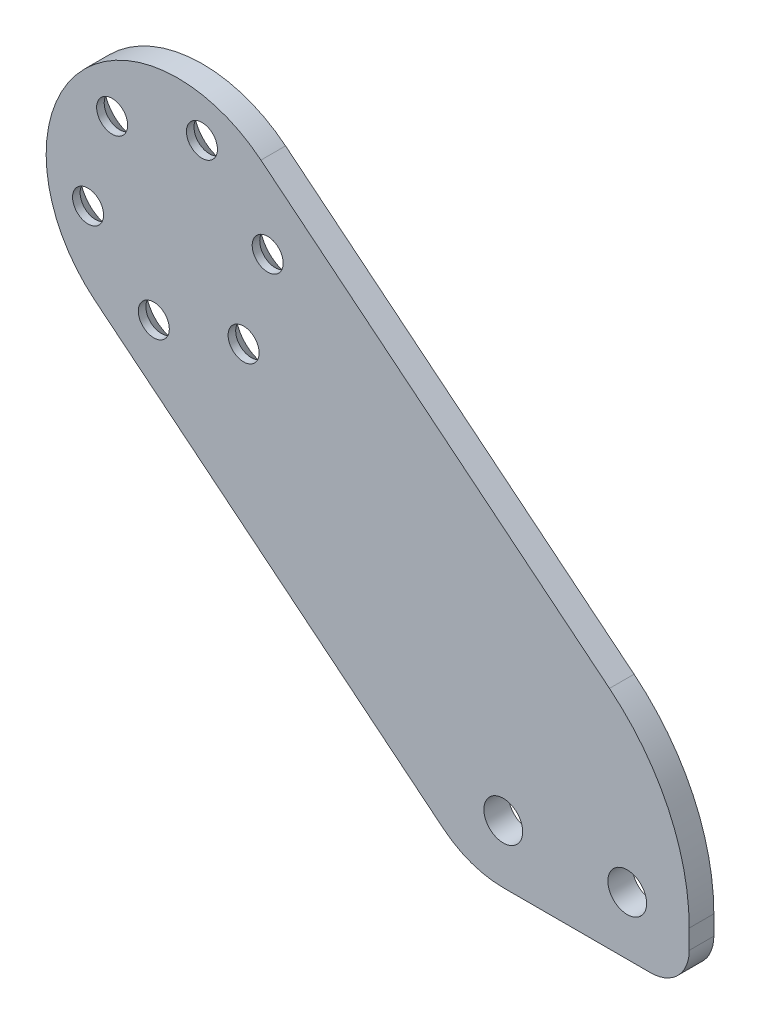
ISO-10303-21;
HEADER;
FILE_DESCRIPTION(('STEP AP214'),'2;1');
FILE_NAME('part.step','',(''),(''),'','','');
FILE_SCHEMA(('AUTOMOTIVE_DESIGN { 1 0 10303 214 1 1 1 1 }'));
ENDSEC;
DATA;
#1=APPLICATION_CONTEXT('core data for automotive mechanical design processes');
#2=APPLICATION_PROTOCOL_DEFINITION('international standard','automotive_design',2000,#1);
#3=PRODUCT_CONTEXT('',#1,'mechanical');
#4=PRODUCT('Part','Part','',(#3));
#5=PRODUCT_RELATED_PRODUCT_CATEGORY('part','',(#4));
#6=PRODUCT_DEFINITION_FORMATION('','',#4);
#7=PRODUCT_DEFINITION_CONTEXT('part definition',#1,'design');
#8=PRODUCT_DEFINITION('design','',#6,#7);
#9=PRODUCT_DEFINITION_SHAPE('','',#8);
#10=(LENGTH_UNIT() NAMED_UNIT(*) SI_UNIT(.MILLI.,.METRE.));
#11=(NAMED_UNIT(*) PLANE_ANGLE_UNIT() SI_UNIT($,.RADIAN.));
#12=(NAMED_UNIT(*) SI_UNIT($,.STERADIAN.) SOLID_ANGLE_UNIT());
#13=UNCERTAINTY_MEASURE_WITH_UNIT(LENGTH_MEASURE(1.E-05),#10,'distance_accuracy_value','');
#14=(GEOMETRIC_REPRESENTATION_CONTEXT(3) GLOBAL_UNCERTAINTY_ASSIGNED_CONTEXT((#13)) GLOBAL_UNIT_ASSIGNED_CONTEXT((#10,
#11,#12)) REPRESENTATION_CONTEXT('',''));
#15=CARTESIAN_POINT('',(0.,0.,0.));
#16=DIRECTION('',(0.,0.,1.));
#17=DIRECTION('',(1.,0.,0.));
#18=AXIS2_PLACEMENT_3D('',#15,#16,#17);
#19=CARTESIAN_POINT('',(38.1233103289566,-45.,3.175));
#20=DIRECTION('',(0.,0.,-1.));
#21=DIRECTION('',(-1.,0.,0.));
#22=AXIS2_PLACEMENT_3D('',#19,#20,#21);
#23=PLANE('',#22);
#24=DIRECTION('',(1.,0.,0.));
#25=VECTOR('',#24,1.);
#26=CARTESIAN_POINT('',(42.,-52.5,3.175));
#27=LINE('',#26,#25);
#28=CARTESIAN_POINT('',(42.,-52.5000000000001,3.175));
#29=VERTEX_POINT('',#28);
#30=CARTESIAN_POINT('',(61.,-52.5,3.175));
#31=VERTEX_POINT('',#30);
#32=EDGE_CURVE('E219',#29,#31,#27,.T.);
#33=ORIENTED_EDGE('',*,*,#32,.T.);
#34=CARTESIAN_POINT('',(61.,-47.5,3.175));
#35=DIRECTION('',(0.,0.,-1.));
#36=DIRECTION('',(-1.,0.,0.));
#37=AXIS2_PLACEMENT_3D('',#34,#35,#36);
#38=CIRCLE('',#37,5.);
#39=CARTESIAN_POINT('',(66.,-47.5,3.175));
#40=VERTEX_POINT('',#39);
#41=EDGE_CURVE('E143',#31,#40,#38,.F.);
#42=ORIENTED_EDGE('',*,*,#41,.T.);
#43=DIRECTION('',(0.,1.,0.));
#44=VECTOR('',#43,1.);
#45=CARTESIAN_POINT('',(66.,-45.,3.175));
#46=LINE('',#45,#44);
#47=CARTESIAN_POINT('',(66.,-45.,3.175));
#48=VERTEX_POINT('',#47);
#49=EDGE_CURVE('E124',#40,#48,#46,.T.);
#50=ORIENTED_EDGE('',*,*,#49,.T.);
#51=CARTESIAN_POINT('',(38.1233103289566,-45.,3.175));
#52=DIRECTION('',(0.,0.,1.));
#53=DIRECTION('',(-1.,0.,0.));
#54=AXIS2_PLACEMENT_3D('',#51,#52,#53);
#55=CIRCLE('',#54,27.8766896710434);
#56=CARTESIAN_POINT('',(55.7051915212923,-23.3669863228849,3.175));
#57=VERTEX_POINT('',#56);
#58=EDGE_CURVE('E119',#48,#57,#55,.T.);
#59=ORIENTED_EDGE('',*,*,#58,.T.);
#60=DIRECTION('',(-0.776025199993032,0.63070190183301,0.));
#61=VECTOR('',#60,1.);
#62=CARTESIAN_POINT('',(55.7051915212923,-23.3669863228849,3.175));
#63=LINE('',#62,#61);
#64=CARTESIAN_POINT('',(10.7219323311611,13.1924283998815,3.175));
#65=VERTEX_POINT('',#64);
#66=EDGE_CURVE('E108',#57,#65,#63,.T.);
#67=ORIENTED_EDGE('',*,*,#66,.T.);
#68=CARTESIAN_POINT('',(0.,0.,3.175));
#69=DIRECTION('',(0.,0.,1.));
#70=DIRECTION('',(1.,0.,0.));
#71=AXIS2_PLACEMENT_3D('',#68,#69,#70);
#72=CIRCLE('',#71,17.);
#73=CARTESIAN_POINT('',(-10.7219323311612,-13.1924283998815,3.175));
#74=VERTEX_POINT('',#73);
#75=EDGE_CURVE('E118',#65,#74,#72,.T.);
#76=ORIENTED_EDGE('',*,*,#75,.T.);
#77=DIRECTION('',(0.776025199993032,-0.63070190183301,0.));
#78=VECTOR('',#77,1.);
#79=CARTESIAN_POINT('',(34.26132685897,-49.751843122648,3.175));
#80=LINE('',#79,#78);
#81=CARTESIAN_POINT('',(34.26132685897,-49.751843122648,3.175));
#82=VERTEX_POINT('',#81);
#83=EDGE_CURVE('E215',#74,#82,#80,.T.);
#84=ORIENTED_EDGE('',*,*,#83,.T.);
#85=CARTESIAN_POINT('',(42.,-40.2300621441937,3.175));
#86=DIRECTION('',(0.,0.,1.));
#87=DIRECTION('',(1.,0.,0.));
#88=AXIS2_PLACEMENT_3D('',#85,#86,#87);
#89=CIRCLE('',#88,12.2699378558064);
#90=EDGE_CURVE('E217',#82,#29,#89,.T.);
#91=ORIENTED_EDGE('',*,*,#90,.T.);
#92=EDGE_LOOP('',(#33,#42,#50,#59,#67,#76,#84,#91));
#93=FACE_BOUND('',#92,.T.);
#94=CARTESIAN_POINT('',(58.,-45.,3.175));
#95=DIRECTION('',(0.,0.,1.));
#96=DIRECTION('',(1.,0.,0.));
#97=AXIS2_PLACEMENT_3D('',#94,#95,#96);
#98=CIRCLE('',#97,2.49999999999994);
#99=CARTESIAN_POINT('',(60.4999999999999,-45.,3.175));
#100=VERTEX_POINT('',#99);
#101=EDGE_CURVE('E210',#100,#100,#98,.T.);
#102=ORIENTED_EDGE('',*,*,#101,.F.);
#103=EDGE_LOOP('',(#102));
#104=FACE_BOUND('',#103,.T.);
#105=CARTESIAN_POINT('',(42.,-45.,3.175));
#106=DIRECTION('',(0.,0.,1.));
#107=DIRECTION('',(1.,0.,0.));
#108=AXIS2_PLACEMENT_3D('',#105,#106,#107);
#109=CIRCLE('',#108,2.49999999999994);
#110=CARTESIAN_POINT('',(44.4999999999999,-45.,3.175));
#111=VERTEX_POINT('',#110);
#112=EDGE_CURVE('E201',#111,#111,#109,.T.);
#113=ORIENTED_EDGE('',*,*,#112,.F.);
#114=EDGE_LOOP('',(#113));
#115=FACE_BOUND('',#114,.T.);
#116=CARTESIAN_POINT('',(-8.48528137423853,8.48528137423861,3.175));
#117=DIRECTION('',(0.,0.,1.));
#118=DIRECTION('',(1.,0.,0.));
#119=AXIS2_PLACEMENT_3D('',#116,#117,#118);
#120=CIRCLE('',#119,2.00000000000003);
#121=CARTESIAN_POINT('',(-6.4852813742385,8.48528137423861,3.175));
#122=VERTEX_POINT('',#121);
#123=EDGE_CURVE('E202',#122,#122,#120,.T.);
#124=ORIENTED_EDGE('',*,*,#123,.F.);
#125=EDGE_LOOP('',(#124));
#126=FACE_BOUND('',#125,.T.);
#127=CARTESIAN_POINT('',(3.1058285412303,11.5911099154688,3.175));
#128=DIRECTION('',(0.,0.,1.));
#129=DIRECTION('',(1.,0.,0.));
#130=AXIS2_PLACEMENT_3D('',#127,#128,#129);
#131=CIRCLE('',#130,2.00000000000004);
#132=CARTESIAN_POINT('',(5.10582854123033,11.5911099154688,3.175));
#133=VERTEX_POINT('',#132);
#134=EDGE_CURVE('E207',#133,#133,#131,.T.);
#135=ORIENTED_EDGE('',*,*,#134,.F.);
#136=EDGE_LOOP('',(#135));
#137=FACE_BOUND('',#136,.T.);
#138=CARTESIAN_POINT('',(11.5911099154688,3.10582854123019,3.175));
#139=DIRECTION('',(0.,0.,1.));
#140=DIRECTION('',(1.,0.,0.));
#141=AXIS2_PLACEMENT_3D('',#138,#139,#140);
#142=CIRCLE('',#141,2.00000000000001);
#143=CARTESIAN_POINT('',(13.5911099154688,3.10582854123019,3.175));
#144=VERTEX_POINT('',#143);
#145=EDGE_CURVE('E494',#144,#144,#142,.T.);
#146=ORIENTED_EDGE('',*,*,#145,.F.);
#147=EDGE_LOOP('',(#146));
#148=FACE_BOUND('',#147,.T.);
#149=CARTESIAN_POINT('',(8.48528137423854,-8.48528137423861,3.175));
#150=DIRECTION('',(0.,0.,1.));
#151=DIRECTION('',(1.,0.,0.));
#152=AXIS2_PLACEMENT_3D('',#149,#150,#151);
#153=CIRCLE('',#152,1.99999999999999);
#154=CARTESIAN_POINT('',(10.4852813742385,-8.48528137423861,3.175));
#155=VERTEX_POINT('',#154);
#156=EDGE_CURVE('E496',#155,#155,#153,.T.);
#157=ORIENTED_EDGE('',*,*,#156,.F.);
#158=EDGE_LOOP('',(#157));
#159=FACE_BOUND('',#158,.T.);
#160=CARTESIAN_POINT('',(-3.10582854123031,-11.5911099154688,3.175));
#161=DIRECTION('',(0.,0.,1.));
#162=DIRECTION('',(1.,0.,0.));
#163=AXIS2_PLACEMENT_3D('',#160,#161,#162);
#164=CIRCLE('',#163,2.);
#165=CARTESIAN_POINT('',(-1.10582854123031,-11.5911099154688,3.175));
#166=VERTEX_POINT('',#165);
#167=EDGE_CURVE('E501',#166,#166,#164,.T.);
#168=ORIENTED_EDGE('',*,*,#167,.F.);
#169=EDGE_LOOP('',(#168));
#170=FACE_BOUND('',#169,.T.);
#171=CARTESIAN_POINT('',(-11.5911099154688,-3.10582854123021,3.175));
#172=DIRECTION('',(0.,0.,1.));
#173=DIRECTION('',(1.,0.,0.));
#174=AXIS2_PLACEMENT_3D('',#171,#172,#173);
#175=CIRCLE('',#174,2.00000000000001);
#176=CARTESIAN_POINT('',(-9.59110991546882,-3.10582854123021,3.175));
#177=VERTEX_POINT('',#176);
#178=EDGE_CURVE('E506',#177,#177,#175,.T.);
#179=ORIENTED_EDGE('',*,*,#178,.F.);
#180=EDGE_LOOP('',(#179));
#181=FACE_BOUND('',#180,.T.);
#182=ADVANCED_FACE('F40',(#93,#104,#115,#126,#137,#148,#159,#170,#181),#23,.F.);
#183=CARTESIAN_POINT('',(38.1233103289566,-45.,0.));
#184=DIRECTION('',(0.,0.,-1.));
#185=DIRECTION('',(-1.,0.,0.));
#186=AXIS2_PLACEMENT_3D('',#183,#184,#185);
#187=PLANE('',#186);
#188=CARTESIAN_POINT('',(8.48528137423854,-8.48528137423861,0.));
#189=DIRECTION('',(0.,0.,-1.));
#190=DIRECTION('',(-1.,0.,0.));
#191=AXIS2_PLACEMENT_3D('',#188,#189,#190);
#192=CIRCLE('',#191,4.19999999999998);
#193=CARTESIAN_POINT('',(4.28528137423855,-8.48528137423861,0.));
#194=VERTEX_POINT('',#193);
#195=EDGE_CURVE('E160',#194,#194,#192,.F.);
#196=ORIENTED_EDGE('',*,*,#195,.T.);
#197=EDGE_LOOP('',(#196));
#198=FACE_BOUND('',#197,.T.);
#199=CARTESIAN_POINT('',(-3.10582854123031,-11.5911099154688,0.));
#200=DIRECTION('',(0.,0.,-1.));
#201=DIRECTION('',(-1.,0.,0.));
#202=AXIS2_PLACEMENT_3D('',#199,#200,#201);
#203=CIRCLE('',#202,4.19999999999998);
#204=CARTESIAN_POINT('',(-7.30582854123029,-11.5911099154688,0.));
#205=VERTEX_POINT('',#204);
#206=EDGE_CURVE('E157',#205,#205,#203,.F.);
#207=ORIENTED_EDGE('',*,*,#206,.T.);
#208=EDGE_LOOP('',(#207));
#209=FACE_BOUND('',#208,.T.);
#210=CARTESIAN_POINT('',(-11.5911099154688,-3.10582854123021,0.));
#211=DIRECTION('',(0.,0.,-1.));
#212=DIRECTION('',(-1.,0.,0.));
#213=AXIS2_PLACEMENT_3D('',#210,#211,#212);
#214=CIRCLE('',#213,4.20000000000001);
#215=CARTESIAN_POINT('',(-15.7911099154688,-3.10582854123021,0.));
#216=VERTEX_POINT('',#215);
#217=EDGE_CURVE('E154',#216,#216,#214,.F.);
#218=ORIENTED_EDGE('',*,*,#217,.T.);
#219=EDGE_LOOP('',(#218));
#220=FACE_BOUND('',#219,.T.);
#221=CARTESIAN_POINT('',(-8.48528137423853,8.48528137423861,0.));
#222=DIRECTION('',(0.,0.,-1.));
#223=DIRECTION('',(-1.,0.,0.));
#224=AXIS2_PLACEMENT_3D('',#221,#222,#223);
#225=CIRCLE('',#224,4.20000000000002);
#226=CARTESIAN_POINT('',(-12.6852813742386,8.48528137423861,0.));
#227=VERTEX_POINT('',#226);
#228=EDGE_CURVE('E151',#227,#227,#225,.F.);
#229=ORIENTED_EDGE('',*,*,#228,.T.);
#230=EDGE_LOOP('',(#229));
#231=FACE_BOUND('',#230,.T.);
#232=CARTESIAN_POINT('',(3.1058285412303,11.5911099154688,0.));
#233=DIRECTION('',(0.,0.,-1.));
#234=DIRECTION('',(-1.,0.,0.));
#235=AXIS2_PLACEMENT_3D('',#232,#233,#234);
#236=CIRCLE('',#235,4.20000000000007);
#237=CARTESIAN_POINT('',(-1.09417145876977,11.5911099154688,0.));
#238=VERTEX_POINT('',#237);
#239=EDGE_CURVE('E148',#238,#238,#236,.F.);
#240=ORIENTED_EDGE('',*,*,#239,.T.);
#241=EDGE_LOOP('',(#240));
#242=FACE_BOUND('',#241,.T.);
#243=CARTESIAN_POINT('',(11.5911099154688,3.10582854123019,0.));
#244=DIRECTION('',(0.,0.,-1.));
#245=DIRECTION('',(-1.,0.,0.));
#246=AXIS2_PLACEMENT_3D('',#243,#244,#245);
#247=CIRCLE('',#246,4.20000000000002);
#248=CARTESIAN_POINT('',(7.39110991546881,3.10582854123019,0.));
#249=VERTEX_POINT('',#248);
#250=EDGE_CURVE('E145',#249,#249,#247,.F.);
#251=ORIENTED_EDGE('',*,*,#250,.T.);
#252=EDGE_LOOP('',(#251));
#253=FACE_BOUND('',#252,.T.);
#254=CARTESIAN_POINT('',(58.,-45.,0.));
#255=DIRECTION('',(0.,0.,1.));
#256=DIRECTION('',(1.,0.,0.));
#257=AXIS2_PLACEMENT_3D('',#254,#255,#256);
#258=CIRCLE('',#257,2.49999999999994);
#259=CARTESIAN_POINT('',(60.4999999999999,-45.,0.));
#260=VERTEX_POINT('',#259);
#261=EDGE_CURVE('E195',#260,#260,#258,.T.);
#262=ORIENTED_EDGE('',*,*,#261,.T.);
#263=EDGE_LOOP('',(#262));
#264=FACE_BOUND('',#263,.T.);
#265=DIRECTION('',(0.,1.,0.));
#266=VECTOR('',#265,1.);
#267=CARTESIAN_POINT('',(66.,-45.,0.));
#268=LINE('',#267,#266);
#269=CARTESIAN_POINT('',(66.,-47.5,0.));
#270=VERTEX_POINT('',#269);
#271=CARTESIAN_POINT('',(66.,-45.,0.));
#272=VERTEX_POINT('',#271);
#273=EDGE_CURVE('E128',#270,#272,#268,.T.);
#274=ORIENTED_EDGE('',*,*,#273,.F.);
#275=CARTESIAN_POINT('',(61.,-47.5,0.));
#276=DIRECTION('',(0.,0.,-1.));
#277=DIRECTION('',(-1.,0.,0.));
#278=AXIS2_PLACEMENT_3D('',#275,#276,#277);
#279=CIRCLE('',#278,5.);
#280=CARTESIAN_POINT('',(61.,-52.5,0.));
#281=VERTEX_POINT('',#280);
#282=EDGE_CURVE('E64',#270,#281,#279,.T.);
#283=ORIENTED_EDGE('',*,*,#282,.T.);
#284=DIRECTION('',(1.,0.,0.));
#285=VECTOR('',#284,1.);
#286=CARTESIAN_POINT('',(42.,-52.5,0.));
#287=LINE('',#286,#285);
#288=CARTESIAN_POINT('',(42.,-52.5000000000001,0.));
#289=VERTEX_POINT('',#288);
#290=EDGE_CURVE('E232',#289,#281,#287,.T.);
#291=ORIENTED_EDGE('',*,*,#290,.F.);
#292=CARTESIAN_POINT('',(42.,-40.2300621441937,0.));
#293=DIRECTION('',(0.,0.,1.));
#294=DIRECTION('',(1.,0.,0.));
#295=AXIS2_PLACEMENT_3D('',#292,#293,#294);
#296=CIRCLE('',#295,12.2699378558064);
#297=CARTESIAN_POINT('',(34.26132685897,-49.751843122648,0.));
#298=VERTEX_POINT('',#297);
#299=EDGE_CURVE('E230',#298,#289,#296,.T.);
#300=ORIENTED_EDGE('',*,*,#299,.F.);
#301=DIRECTION('',(0.776025199993032,-0.63070190183301,0.));
#302=VECTOR('',#301,1.);
#303=CARTESIAN_POINT('',(34.26132685897,-49.751843122648,0.));
#304=LINE('',#303,#302);
#305=CARTESIAN_POINT('',(-10.7219323311612,-13.1924283998815,0.));
#306=VERTEX_POINT('',#305);
#307=EDGE_CURVE('E228',#306,#298,#304,.T.);
#308=ORIENTED_EDGE('',*,*,#307,.F.);
#309=CARTESIAN_POINT('',(0.,0.,0.));
#310=DIRECTION('',(0.,0.,1.));
#311=DIRECTION('',(1.,0.,0.));
#312=AXIS2_PLACEMENT_3D('',#309,#310,#311);
#313=CIRCLE('',#312,17.);
#314=CARTESIAN_POINT('',(10.7219323311611,13.1924283998815,0.));
#315=VERTEX_POINT('',#314);
#316=EDGE_CURVE('E226',#315,#306,#313,.T.);
#317=ORIENTED_EDGE('',*,*,#316,.F.);
#318=DIRECTION('',(-0.776025199993032,0.63070190183301,0.));
#319=VECTOR('',#318,1.);
#320=CARTESIAN_POINT('',(55.7051915212923,-23.3669863228849,0.));
#321=LINE('',#320,#319);
#322=CARTESIAN_POINT('',(55.7051915212923,-23.3669863228849,0.));
#323=VERTEX_POINT('',#322);
#324=EDGE_CURVE('E224',#323,#315,#321,.T.);
#325=ORIENTED_EDGE('',*,*,#324,.F.);
#326=CARTESIAN_POINT('',(38.1233103289566,-45.,0.));
#327=DIRECTION('',(0.,0.,1.));
#328=DIRECTION('',(-1.,0.,0.));
#329=AXIS2_PLACEMENT_3D('',#326,#327,#328);
#330=CIRCLE('',#329,27.8766896710434);
#331=EDGE_CURVE('E132',#272,#323,#330,.T.);
#332=ORIENTED_EDGE('',*,*,#331,.F.);
#333=EDGE_LOOP('',(#274,#283,#291,#300,#308,#317,#325,#332));
#334=FACE_BOUND('',#333,.T.);
#335=CARTESIAN_POINT('',(42.,-45.,0.));
#336=DIRECTION('',(0.,0.,1.));
#337=DIRECTION('',(1.,0.,0.));
#338=AXIS2_PLACEMENT_3D('',#335,#336,#337);
#339=CIRCLE('',#338,2.49999999999994);
#340=CARTESIAN_POINT('',(44.4999999999999,-45.,0.));
#341=VERTEX_POINT('',#340);
#342=EDGE_CURVE('E199',#341,#341,#339,.T.);
#343=ORIENTED_EDGE('',*,*,#342,.T.);
#344=EDGE_LOOP('',(#343));
#345=FACE_BOUND('',#344,.T.);
#346=ADVANCED_FACE('F186',(#198,#209,#220,#231,#242,#253,#264,#334,#345),#187,.T.);
#347=CARTESIAN_POINT('',(38.1233103289566,-45.,3.175));
#348=DIRECTION('',(0.,0.,-1.));
#349=DIRECTION('',(-1.,0.,0.));
#350=AXIS2_PLACEMENT_3D('',#347,#348,#349);
#351=CYLINDRICAL_SURFACE('',#350,27.8766896710434);
#352=ORIENTED_EDGE('',*,*,#331,.T.);
#353=DIRECTION('',(0.,0.,-1.));
#354=VECTOR('',#353,1.);
#355=CARTESIAN_POINT('',(55.7051915212923,-23.3669863228849,3.175));
#356=LINE('',#355,#354);
#357=EDGE_CURVE('E112',#57,#323,#356,.T.);
#358=ORIENTED_EDGE('',*,*,#357,.F.);
#359=ORIENTED_EDGE('',*,*,#58,.F.);
#360=DIRECTION('',(0.,0.,-1.));
#361=VECTOR('',#360,1.);
#362=CARTESIAN_POINT('',(66.,-45.,3.175));
#363=LINE('',#362,#361);
#364=EDGE_CURVE('E222',#48,#272,#363,.T.);
#365=ORIENTED_EDGE('',*,*,#364,.T.);
#366=EDGE_LOOP('',(#352,#358,#359,#365));
#367=FACE_BOUND('',#366,.T.);
#368=ADVANCED_FACE('F130',(#367),#351,.T.);
#369=CARTESIAN_POINT('',(55.7051915212923,-23.3669863228849,3.175));
#370=DIRECTION('',(-0.630701901833009,-0.776025199993032,0.));
#371=DIRECTION('',(0.776025199993032,-0.63070190183301,0.));
#372=AXIS2_PLACEMENT_3D('',#369,#370,#371);
#373=PLANE('',#372);
#374=ORIENTED_EDGE('',*,*,#324,.T.);
#375=DIRECTION('',(0.,0.,-1.));
#376=VECTOR('',#375,1.);
#377=CARTESIAN_POINT('',(10.7219323311611,13.1924283998815,3.175));
#378=LINE('',#377,#376);
#379=EDGE_CURVE('E115',#65,#315,#378,.T.);
#380=ORIENTED_EDGE('',*,*,#379,.F.);
#381=ORIENTED_EDGE('',*,*,#66,.F.);
#382=ORIENTED_EDGE('',*,*,#357,.T.);
#383=EDGE_LOOP('',(#374,#380,#381,#382));
#384=FACE_BOUND('',#383,.T.);
#385=ADVANCED_FACE('F110',(#384),#373,.F.);
#386=CARTESIAN_POINT('',(0.,0.,3.175));
#387=DIRECTION('',(0.,0.,-1.));
#388=DIRECTION('',(-1.,0.,0.));
#389=AXIS2_PLACEMENT_3D('',#386,#387,#388);
#390=CYLINDRICAL_SURFACE('',#389,17.);
#391=ORIENTED_EDGE('',*,*,#316,.T.);
#392=DIRECTION('',(0.,0.,-1.));
#393=VECTOR('',#392,1.);
#394=CARTESIAN_POINT('',(-10.7219323311612,-13.1924283998815,3.175));
#395=LINE('',#394,#393);
#396=EDGE_CURVE('E137',#74,#306,#395,.T.);
#397=ORIENTED_EDGE('',*,*,#396,.F.);
#398=ORIENTED_EDGE('',*,*,#75,.F.);
#399=ORIENTED_EDGE('',*,*,#379,.T.);
#400=EDGE_LOOP('',(#391,#397,#398,#399));
#401=FACE_BOUND('',#400,.T.);
#402=ADVANCED_FACE('F262',(#401),#390,.T.);
#403=CARTESIAN_POINT('',(34.26132685897,-49.751843122648,3.175));
#404=DIRECTION('',(0.63070190183301,0.776025199993032,0.));
#405=DIRECTION('',(-0.776025199993032,0.63070190183301,0.));
#406=AXIS2_PLACEMENT_3D('',#403,#404,#405);
#407=PLANE('',#406);
#408=ORIENTED_EDGE('',*,*,#307,.T.);
#409=DIRECTION('',(0.,0.,-1.));
#410=VECTOR('',#409,1.);
#411=CARTESIAN_POINT('',(34.26132685897,-49.751843122648,3.175));
#412=LINE('',#411,#410);
#413=EDGE_CURVE('E239',#82,#298,#412,.T.);
#414=ORIENTED_EDGE('',*,*,#413,.F.);
#415=ORIENTED_EDGE('',*,*,#83,.F.);
#416=ORIENTED_EDGE('',*,*,#396,.T.);
#417=EDGE_LOOP('',(#408,#414,#415,#416));
#418=FACE_BOUND('',#417,.T.);
#419=ADVANCED_FACE('F246',(#418),#407,.F.);
#420=CARTESIAN_POINT('',(42.,-40.2300621441937,3.175));
#421=DIRECTION('',(0.,0.,-1.));
#422=DIRECTION('',(-1.,0.,0.));
#423=AXIS2_PLACEMENT_3D('',#420,#421,#422);
#424=CYLINDRICAL_SURFACE('',#423,12.2699378558064);
#425=ORIENTED_EDGE('',*,*,#299,.T.);
#426=DIRECTION('',(0.,0.,-1.));
#427=VECTOR('',#426,1.);
#428=CARTESIAN_POINT('',(42.,-52.5000000000001,3.175));
#429=LINE('',#428,#427);
#430=EDGE_CURVE('E236',#29,#289,#429,.T.);
#431=ORIENTED_EDGE('',*,*,#430,.F.);
#432=ORIENTED_EDGE('',*,*,#90,.F.);
#433=ORIENTED_EDGE('',*,*,#413,.T.);
#434=EDGE_LOOP('',(#425,#431,#432,#433));
#435=FACE_BOUND('',#434,.T.);
#436=ADVANCED_FACE('F253',(#435),#424,.T.);
#437=CARTESIAN_POINT('',(42.,-52.5,3.175));
#438=DIRECTION('',(0.,1.,0.));
#439=DIRECTION('',(0.,0.,1.));
#440=AXIS2_PLACEMENT_3D('',#437,#438,#439);
#441=PLANE('',#440);
#442=ORIENTED_EDGE('',*,*,#290,.T.);
#443=DIRECTION('',(0.,0.,-1.));
#444=VECTOR('',#443,1.);
#445=CARTESIAN_POINT('',(61.,-52.5,3.175));
#446=LINE('',#445,#444);
#447=EDGE_CURVE('E56',#281,#31,#446,.F.);
#448=ORIENTED_EDGE('',*,*,#447,.T.);
#449=ORIENTED_EDGE('',*,*,#32,.F.);
#450=ORIENTED_EDGE('',*,*,#430,.T.);
#451=EDGE_LOOP('',(#442,#448,#449,#450));
#452=FACE_BOUND('',#451,.T.);
#453=ADVANCED_FACE('F255',(#452),#441,.F.);
#454=CARTESIAN_POINT('',(66.,-45.,3.175));
#455=DIRECTION('',(-1.,0.,0.));
#456=DIRECTION('',(0.,-1.,0.));
#457=AXIS2_PLACEMENT_3D('',#454,#455,#456);
#458=PLANE('',#457);
#459=ORIENTED_EDGE('',*,*,#49,.F.);
#460=DIRECTION('',(0.,0.,-1.));
#461=VECTOR('',#460,1.);
#462=CARTESIAN_POINT('',(66.,-47.5,3.175));
#463=LINE('',#462,#461);
#464=EDGE_CURVE('E133',#40,#270,#463,.T.);
#465=ORIENTED_EDGE('',*,*,#464,.T.);
#466=ORIENTED_EDGE('',*,*,#273,.T.);
#467=ORIENTED_EDGE('',*,*,#364,.F.);
#468=EDGE_LOOP('',(#459,#465,#466,#467));
#469=FACE_BOUND('',#468,.T.);
#470=ADVANCED_FACE('F261',(#469),#458,.F.);
#471=CARTESIAN_POINT('',(58.,-45.,3.175));
#472=DIRECTION('',(0.,0.,-1.));
#473=DIRECTION('',(-1.,0.,0.));
#474=AXIS2_PLACEMENT_3D('',#471,#472,#473);
#475=CYLINDRICAL_SURFACE('',#474,2.49999999999994);
#476=ORIENTED_EDGE('',*,*,#101,.T.);
#477=EDGE_LOOP('',(#476));
#478=FACE_BOUND('',#477,.T.);
#479=ORIENTED_EDGE('',*,*,#261,.F.);
#480=EDGE_LOOP('',(#479));
#481=FACE_BOUND('',#480,.T.);
#482=ADVANCED_FACE('F276',(#478,#481),#475,.F.);
#483=CARTESIAN_POINT('',(42.,-45.,3.175));
#484=DIRECTION('',(0.,0.,-1.));
#485=DIRECTION('',(-1.,0.,0.));
#486=AXIS2_PLACEMENT_3D('',#483,#484,#485);
#487=CYLINDRICAL_SURFACE('',#486,2.49999999999994);
#488=ORIENTED_EDGE('',*,*,#112,.T.);
#489=EDGE_LOOP('',(#488));
#490=FACE_BOUND('',#489,.T.);
#491=ORIENTED_EDGE('',*,*,#342,.F.);
#492=EDGE_LOOP('',(#491));
#493=FACE_BOUND('',#492,.T.);
#494=ADVANCED_FACE('F303',(#490,#493),#487,.F.);
#495=CARTESIAN_POINT('',(-8.48528137423853,8.48528137423861,3.175));
#496=DIRECTION('',(0.,0.,-1.));
#497=DIRECTION('',(-1.,0.,0.));
#498=AXIS2_PLACEMENT_3D('',#495,#496,#497);
#499=CYLINDRICAL_SURFACE('',#498,2.00000000000003);
#500=CARTESIAN_POINT('',(-8.48528137423853,8.48528137423861,2.2));
#501=DIRECTION('',(0.,0.,-1.));
#502=DIRECTION('',(-1.,0.,0.));
#503=AXIS2_PLACEMENT_3D('',#500,#501,#502);
#504=CIRCLE('',#503,2.00000000000003);
#505=CARTESIAN_POINT('',(-10.4852813742386,8.48528137423861,2.2));
#506=VERTEX_POINT('',#505);
#507=EDGE_CURVE('E172',#506,#506,#504,.T.);
#508=ORIENTED_EDGE('',*,*,#507,.T.);
#509=EDGE_LOOP('',(#508));
#510=FACE_BOUND('',#509,.T.);
#511=ORIENTED_EDGE('',*,*,#123,.T.);
#512=EDGE_LOOP('',(#511));
#513=FACE_BOUND('',#512,.T.);
#514=ADVANCED_FACE('F310',(#510,#513),#499,.F.);
#515=CARTESIAN_POINT('',(3.1058285412303,11.5911099154688,3.175));
#516=DIRECTION('',(0.,0.,-1.));
#517=DIRECTION('',(-1.,0.,0.));
#518=AXIS2_PLACEMENT_3D('',#515,#516,#517);
#519=CYLINDRICAL_SURFACE('',#518,2.00000000000004);
#520=CARTESIAN_POINT('',(3.1058285412303,11.5911099154688,2.20000000000002));
#521=DIRECTION('',(0.,0.,-1.));
#522=DIRECTION('',(-1.,0.,0.));
#523=AXIS2_PLACEMENT_3D('',#520,#521,#522);
#524=CIRCLE('',#523,2.00000000000004);
#525=CARTESIAN_POINT('',(1.10582854123026,11.5911099154688,2.20000000000002));
#526=VERTEX_POINT('',#525);
#527=EDGE_CURVE('E49',#526,#526,#524,.T.);
#528=ORIENTED_EDGE('',*,*,#527,.T.);
#529=EDGE_LOOP('',(#528));
#530=FACE_BOUND('',#529,.T.);
#531=ORIENTED_EDGE('',*,*,#134,.T.);
#532=EDGE_LOOP('',(#531));
#533=FACE_BOUND('',#532,.T.);
#534=ADVANCED_FACE('F177',(#530,#533),#519,.F.);
#535=CARTESIAN_POINT('',(11.5911099154688,3.10582854123019,3.175));
#536=DIRECTION('',(0.,0.,-1.));
#537=DIRECTION('',(-1.,0.,0.));
#538=AXIS2_PLACEMENT_3D('',#535,#536,#537);
#539=CYLINDRICAL_SURFACE('',#538,2.00000000000001);
#540=CARTESIAN_POINT('',(11.5911099154688,3.10582854123019,2.20000000000002));
#541=DIRECTION('',(0.,0.,-1.));
#542=DIRECTION('',(-1.,0.,0.));
#543=AXIS2_PLACEMENT_3D('',#540,#541,#542);
#544=CIRCLE('',#543,2.00000000000001);
#545=CARTESIAN_POINT('',(9.59110991546882,3.10582854123019,2.20000000000002));
#546=VERTEX_POINT('',#545);
#547=EDGE_CURVE('E11',#546,#546,#544,.T.);
#548=ORIENTED_EDGE('',*,*,#547,.T.);
#549=EDGE_LOOP('',(#548));
#550=FACE_BOUND('',#549,.T.);
#551=ORIENTED_EDGE('',*,*,#145,.T.);
#552=EDGE_LOOP('',(#551));
#553=FACE_BOUND('',#552,.T.);
#554=ADVANCED_FACE('F325',(#550,#553),#539,.F.);
#555=CARTESIAN_POINT('',(8.48528137423854,-8.48528137423861,3.175));
#556=DIRECTION('',(0.,0.,-1.));
#557=DIRECTION('',(-1.,0.,0.));
#558=AXIS2_PLACEMENT_3D('',#555,#556,#557);
#559=CYLINDRICAL_SURFACE('',#558,1.99999999999999);
#560=CARTESIAN_POINT('',(8.48528137423854,-8.48528137423861,2.2));
#561=DIRECTION('',(0.,0.,-1.));
#562=DIRECTION('',(-1.,0.,0.));
#563=AXIS2_PLACEMENT_3D('',#560,#561,#562);
#564=CIRCLE('',#563,1.99999999999999);
#565=CARTESIAN_POINT('',(6.48528137423855,-8.48528137423861,2.2));
#566=VERTEX_POINT('',#565);
#567=EDGE_CURVE('E163',#566,#566,#564,.T.);
#568=ORIENTED_EDGE('',*,*,#567,.T.);
#569=EDGE_LOOP('',(#568));
#570=FACE_BOUND('',#569,.T.);
#571=ORIENTED_EDGE('',*,*,#156,.T.);
#572=EDGE_LOOP('',(#571));
#573=FACE_BOUND('',#572,.T.);
#574=ADVANCED_FACE('F332',(#570,#573),#559,.F.);
#575=CARTESIAN_POINT('',(-3.10582854123031,-11.5911099154688,3.175));
#576=DIRECTION('',(0.,0.,-1.));
#577=DIRECTION('',(-1.,0.,0.));
#578=AXIS2_PLACEMENT_3D('',#575,#576,#577);
#579=CYLINDRICAL_SURFACE('',#578,2.);
#580=CARTESIAN_POINT('',(-3.10582854123031,-11.5911099154688,2.19999999999999));
#581=DIRECTION('',(0.,0.,-1.));
#582=DIRECTION('',(-1.,0.,0.));
#583=AXIS2_PLACEMENT_3D('',#580,#581,#582);
#584=CIRCLE('',#583,2.);
#585=CARTESIAN_POINT('',(-5.1058285412303,-11.5911099154688,2.19999999999999));
#586=VERTEX_POINT('',#585);
#587=EDGE_CURVE('E166',#586,#586,#584,.T.);
#588=ORIENTED_EDGE('',*,*,#587,.T.);
#589=EDGE_LOOP('',(#588));
#590=FACE_BOUND('',#589,.T.);
#591=ORIENTED_EDGE('',*,*,#167,.T.);
#592=EDGE_LOOP('',(#591));
#593=FACE_BOUND('',#592,.T.);
#594=ADVANCED_FACE('F340',(#590,#593),#579,.F.);
#595=CARTESIAN_POINT('',(-11.5911099154688,-3.10582854123021,3.175));
#596=DIRECTION('',(0.,0.,-1.));
#597=DIRECTION('',(-1.,0.,0.));
#598=AXIS2_PLACEMENT_3D('',#595,#596,#597);
#599=CYLINDRICAL_SURFACE('',#598,2.00000000000001);
#600=CARTESIAN_POINT('',(-11.5911099154688,-3.10582854123021,2.20000000000001));
#601=DIRECTION('',(0.,0.,-1.));
#602=DIRECTION('',(-1.,0.,0.));
#603=AXIS2_PLACEMENT_3D('',#600,#601,#602);
#604=CIRCLE('',#603,2.00000000000001);
#605=CARTESIAN_POINT('',(-13.5911099154688,-3.10582854123021,2.20000000000001));
#606=VERTEX_POINT('',#605);
#607=EDGE_CURVE('E169',#606,#606,#604,.T.);
#608=ORIENTED_EDGE('',*,*,#607,.T.);
#609=EDGE_LOOP('',(#608));
#610=FACE_BOUND('',#609,.T.);
#611=ORIENTED_EDGE('',*,*,#178,.T.);
#612=EDGE_LOOP('',(#611));
#613=FACE_BOUND('',#612,.T.);
#614=ADVANCED_FACE('F348',(#610,#613),#599,.F.);
#615=CARTESIAN_POINT('',(61.,-47.5,3.175));
#616=DIRECTION('',(0.,0.,-1.));
#617=DIRECTION('',(-1.,0.,0.));
#618=AXIS2_PLACEMENT_3D('',#615,#616,#617);
#619=CYLINDRICAL_SURFACE('',#618,5.);
#620=ORIENTED_EDGE('',*,*,#41,.F.);
#621=ORIENTED_EDGE('',*,*,#447,.F.);
#622=ORIENTED_EDGE('',*,*,#282,.F.);
#623=ORIENTED_EDGE('',*,*,#464,.F.);
#624=EDGE_LOOP('',(#620,#621,#622,#623));
#625=FACE_BOUND('',#624,.T.);
#626=ADVANCED_FACE('F259',(#625),#619,.T.);
#627=CARTESIAN_POINT('',(8.48528137423854,-8.48528137423861,0.));
#628=DIRECTION('',(0.,0.,-1.));
#629=DIRECTION('',(-1.,0.,0.));
#630=AXIS2_PLACEMENT_3D('',#627,#628,#629);
#631=CONICAL_SURFACE('',#630,4.19999999999998,0.785398163397447);
#632=ORIENTED_EDGE('',*,*,#567,.F.);
#633=EDGE_LOOP('',(#632));
#634=FACE_BOUND('',#633,.T.);
#635=ORIENTED_EDGE('',*,*,#195,.F.);
#636=EDGE_LOOP('',(#635));
#637=FACE_BOUND('',#636,.T.);
#638=ADVANCED_FACE('F363',(#634,#637),#631,.F.);
#639=CARTESIAN_POINT('',(-3.10582854123031,-11.5911099154688,0.));
#640=DIRECTION('',(0.,0.,-1.));
#641=DIRECTION('',(-1.,0.,0.));
#642=AXIS2_PLACEMENT_3D('',#639,#640,#641);
#643=CONICAL_SURFACE('',#642,4.19999999999998,0.785398163397447);
#644=ORIENTED_EDGE('',*,*,#587,.F.);
#645=EDGE_LOOP('',(#644));
#646=FACE_BOUND('',#645,.T.);
#647=ORIENTED_EDGE('',*,*,#206,.F.);
#648=EDGE_LOOP('',(#647));
#649=FACE_BOUND('',#648,.T.);
#650=ADVANCED_FACE('F369',(#646,#649),#643,.F.);
#651=CARTESIAN_POINT('',(-11.5911099154688,-3.10582854123021,0.));
#652=DIRECTION('',(0.,0.,-1.));
#653=DIRECTION('',(-1.,0.,0.));
#654=AXIS2_PLACEMENT_3D('',#651,#652,#653);
#655=CONICAL_SURFACE('',#654,4.20000000000001,0.785398163397446);
#656=ORIENTED_EDGE('',*,*,#607,.F.);
#657=EDGE_LOOP('',(#656));
#658=FACE_BOUND('',#657,.T.);
#659=ORIENTED_EDGE('',*,*,#217,.F.);
#660=EDGE_LOOP('',(#659));
#661=FACE_BOUND('',#660,.T.);
#662=ADVANCED_FACE('F377',(#658,#661),#655,.F.);
#663=CARTESIAN_POINT('',(-8.48528137423853,8.48528137423861,0.));
#664=DIRECTION('',(0.,0.,-1.));
#665=DIRECTION('',(-1.,0.,0.));
#666=AXIS2_PLACEMENT_3D('',#663,#664,#665);
#667=CONICAL_SURFACE('',#666,4.20000000000002,0.785398163397446);
#668=ORIENTED_EDGE('',*,*,#507,.F.);
#669=EDGE_LOOP('',(#668));
#670=FACE_BOUND('',#669,.T.);
#671=ORIENTED_EDGE('',*,*,#228,.F.);
#672=EDGE_LOOP('',(#671));
#673=FACE_BOUND('',#672,.T.);
#674=ADVANCED_FACE('F183',(#670,#673),#667,.F.);
#675=CARTESIAN_POINT('',(3.1058285412303,11.5911099154688,0.));
#676=DIRECTION('',(0.,0.,-1.));
#677=DIRECTION('',(-1.,0.,0.));
#678=AXIS2_PLACEMENT_3D('',#675,#676,#677);
#679=CONICAL_SURFACE('',#678,4.20000000000007,0.78539816339745);
#680=ORIENTED_EDGE('',*,*,#527,.F.);
#681=EDGE_LOOP('',(#680));
#682=FACE_BOUND('',#681,.T.);
#683=ORIENTED_EDGE('',*,*,#239,.F.);
#684=EDGE_LOOP('',(#683));
#685=FACE_BOUND('',#684,.T.);
#686=ADVANCED_FACE('F180',(#682,#685),#679,.F.);
#687=CARTESIAN_POINT('',(11.5911099154688,3.10582854123019,0.));
#688=DIRECTION('',(0.,0.,-1.));
#689=DIRECTION('',(-1.,0.,0.));
#690=AXIS2_PLACEMENT_3D('',#687,#688,#689);
#691=CONICAL_SURFACE('',#690,4.20000000000002,0.785398163397446);
#692=ORIENTED_EDGE('',*,*,#547,.F.);
#693=EDGE_LOOP('',(#692));
#694=FACE_BOUND('',#693,.T.);
#695=ORIENTED_EDGE('',*,*,#250,.F.);
#696=EDGE_LOOP('',(#695));
#697=FACE_BOUND('',#696,.T.);
#698=ADVANCED_FACE('F43',(#694,#697),#691,.F.);
#699=CLOSED_SHELL('',(#182,#346,#368,#385,#402,#419,#436,#453,#470,#482,#494,#514,#534,#554,
#574,#594,#614,#626,#638,#650,#662,#674,#686,#698));
#700=MANIFOLD_SOLID_BREP('B2',#699);
#701=ADVANCED_BREP_SHAPE_REPRESENTATION('',(#18,#700),#14);
#702=SHAPE_DEFINITION_REPRESENTATION(#9,#701);
ENDSEC;
END-ISO-10303-21;
